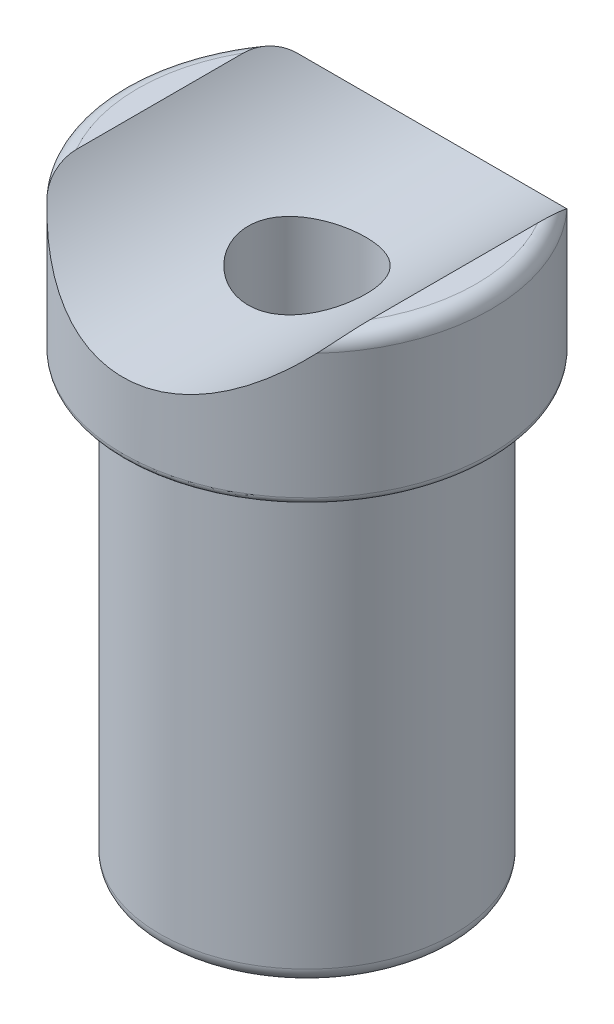
ISO-10303-21;
HEADER;
FILE_DESCRIPTION(('STEP AP214'),'2;1');
FILE_NAME('part.step','',(''),(''),'','','');
FILE_SCHEMA(('AUTOMOTIVE_DESIGN { 1 0 10303 214 1 1 1 1 }'));
ENDSEC;
DATA;
#1=APPLICATION_CONTEXT('core data for automotive mechanical design processes');
#2=APPLICATION_PROTOCOL_DEFINITION('international standard','automotive_design',2000,#1);
#3=PRODUCT_CONTEXT('',#1,'mechanical');
#4=PRODUCT('Part','Part','',(#3));
#5=PRODUCT_RELATED_PRODUCT_CATEGORY('part','',(#4));
#6=PRODUCT_DEFINITION_FORMATION('','',#4);
#7=PRODUCT_DEFINITION_CONTEXT('part definition',#1,'design');
#8=PRODUCT_DEFINITION('design','',#6,#7);
#9=PRODUCT_DEFINITION_SHAPE('','',#8);
#10=(LENGTH_UNIT() NAMED_UNIT(*) SI_UNIT(.MILLI.,.METRE.));
#11=(NAMED_UNIT(*) PLANE_ANGLE_UNIT() SI_UNIT($,.RADIAN.));
#12=(NAMED_UNIT(*) SI_UNIT($,.STERADIAN.) SOLID_ANGLE_UNIT());
#13=UNCERTAINTY_MEASURE_WITH_UNIT(LENGTH_MEASURE(1.E-05),#10,'distance_accuracy_value','');
#14=(GEOMETRIC_REPRESENTATION_CONTEXT(3) GLOBAL_UNCERTAINTY_ASSIGNED_CONTEXT((#13)) GLOBAL_UNIT_ASSIGNED_CONTEXT((#10,
#11,#12)) REPRESENTATION_CONTEXT('',''));
#15=CARTESIAN_POINT('',(0.,0.,0.));
#16=DIRECTION('',(0.,0.,1.));
#17=DIRECTION('',(1.,0.,0.));
#18=AXIS2_PLACEMENT_3D('',#15,#16,#17);
#19=CARTESIAN_POINT('',(-12.5,33.,0.));
#20=DIRECTION('',(0.,1.,0.));
#21=DIRECTION('',(0.,0.,1.));
#22=AXIS2_PLACEMENT_3D('',#19,#20,#21);
#23=PLANE('',#22);
#24=DIRECTION('',(0.,0.,1.));
#25=VECTOR('',#24,1.);
#26=CARTESIAN_POINT('',(-9.99999999999999,33.,-12.5));
#27=LINE('',#26,#25);
#28=CARTESIAN_POINT('',(-9.99999999999999,33.,-5.67890834580031));
#29=VERTEX_POINT('',#28);
#30=CARTESIAN_POINT('',(-9.99999999999999,33.,5.67890834580031));
#31=VERTEX_POINT('',#30);
#32=EDGE_CURVE('E89',#29,#31,#27,.T.);
#33=ORIENTED_EDGE('',*,*,#32,.F.);
#34=CARTESIAN_POINT('',(0.,33.,0.));
#35=DIRECTION('',(0.,1.,0.));
#36=DIRECTION('',(0.,0.,1.));
#37=AXIS2_PLACEMENT_3D('',#34,#35,#36);
#38=CIRCLE('',#37,11.5);
#39=EDGE_CURVE('E183',#29,#31,#38,.T.);
#40=ORIENTED_EDGE('',*,*,#39,.T.);
#41=EDGE_LOOP('',(#33,#40));
#42=FACE_BOUND('',#41,.T.);
#43=ADVANCED_FACE('F34',(#42),#23,.T.);
#44=DIRECTION('',(0.,0.,1.));
#45=VECTOR('',#44,1.);
#46=CARTESIAN_POINT('',(9.99999999999999,33.,-12.5));
#47=LINE('',#46,#45);
#48=CARTESIAN_POINT('',(9.99999999999999,33.,5.67890834580031));
#49=VERTEX_POINT('',#48);
#50=CARTESIAN_POINT('',(9.99999999999999,33.,-5.67890834580031));
#51=VERTEX_POINT('',#50);
#52=EDGE_CURVE('E78',#49,#51,#47,.F.);
#53=ORIENTED_EDGE('',*,*,#52,.F.);
#54=CARTESIAN_POINT('',(0.,33.,0.));
#55=DIRECTION('',(0.,1.,0.));
#56=DIRECTION('',(0.,0.,1.));
#57=AXIS2_PLACEMENT_3D('',#54,#55,#56);
#58=CIRCLE('',#57,11.5);
#59=EDGE_CURVE('E88',#49,#51,#58,.T.);
#60=ORIENTED_EDGE('',*,*,#59,.T.);
#61=EDGE_LOOP('',(#53,#60));
#62=FACE_BOUND('',#61,.T.);
#63=ADVANCED_FACE('F87',(#62),#23,.T.);
#64=CARTESIAN_POINT('',(0.,98.8342659185942,0.));
#65=DIRECTION('',(0.,1.,0.));
#66=DIRECTION('',(0.,0.,1.));
#67=AXIS2_PLACEMENT_3D('',#64,#65,#66);
#68=CYLINDRICAL_SURFACE('',#67,4.);
#69=CARTESIAN_POINT('',(0.,28.,4.));
#70=CARTESIAN_POINT('',(-0.218739515789949,28.0000005364093,3.99999939087354));
#71=CARTESIAN_POINT('',(-0.437486592647652,28.0057953960911,3.98199851180186));
#72=CARTESIAN_POINT('',(-0.868567253093707,28.0283434456943,3.91067045117685));
#73=CARTESIAN_POINT('',(-1.08089965843427,28.045098636161,3.85733682045523));
#74=CARTESIAN_POINT('',(-1.49287306447891,28.0877404091148,3.71733769697058));
#75=CARTESIAN_POINT('',(-1.69253368346149,28.1136124488703,3.63072526907349));
#76=CARTESIAN_POINT('',(-2.07449690712789,28.1718274589282,3.42685792478185));
#77=CARTESIAN_POINT('',(-2.25679651756237,28.2041715424903,3.30959773558599));
#78=CARTESIAN_POINT('',(-2.60473689448745,28.2730733016545,3.04378971623992));
#79=CARTESIAN_POINT('',(-2.76974023061599,28.3097260566775,2.89443225261642));
#80=CARTESIAN_POINT('',(-3.07283559233071,28.3825733574228,2.57039233363151));
#81=CARTESIAN_POINT('',(-3.21092229484498,28.4187678111901,2.39570488086294));
#82=CARTESIAN_POINT('',(-3.45978487684573,28.487629730026,2.02036786372393));
#83=CARTESIAN_POINT('',(-3.56975307774839,28.5201803591213,1.81915929682323));
#84=CARTESIAN_POINT('',(-3.75402292836496,28.5766335550272,1.39989414057514));
#85=CARTESIAN_POINT('',(-3.82833449433394,28.6005385257747,1.18184225503077));
#86=CARTESIAN_POINT('',(-3.93682835778228,28.6359969310092,0.74229348181632));
#87=CARTESIAN_POINT('',(-3.97219742115687,28.6479146267701,0.521119745614448));
#88=CARTESIAN_POINT('',(-4.00551082647404,28.6591292237863,0.075681002044328));
#89=CARTESIAN_POINT('',(-4.00346567735334,28.6584296689868,-0.148583119609549));
#90=CARTESIAN_POINT('',(-3.96293451839879,28.6448095228146,-0.583913962249063));
#91=CARTESIAN_POINT('',(-3.92597105327878,28.6323995653976,-0.795141133700956));
#92=CARTESIAN_POINT('',(-3.81912647431514,28.5975885650021,-1.20822211113994));
#93=CARTESIAN_POINT('',(-3.74924170672462,28.5751864130619,-1.41007487398266));
#94=CARTESIAN_POINT('',(-3.57749112898224,28.5225336455928,-1.80224464703698));
#95=CARTESIAN_POINT('',(-3.47515682759627,28.4921692631811,-1.99234054987134));
#96=CARTESIAN_POINT('',(-3.24173735834849,28.4270638785557,-2.35315510757427));
#97=CARTESIAN_POINT('',(-3.110644420678,28.3923216946597,-2.52386850686086));
#98=CARTESIAN_POINT('',(-2.81601378851059,28.3203406964289,-2.8496616821636));
#99=CARTESIAN_POINT('',(-2.65122340623531,28.283061979789,-3.00360194234647));
#100=CARTESIAN_POINT('',(-2.29770358054263,28.2116707971346,-3.28194669558469));
#101=CARTESIAN_POINT('',(-2.10897218913167,28.1775585891591,-3.40634878285739));
#102=CARTESIAN_POINT('',(-1.71065395178101,28.1159552563836,-3.62290860820041));
#103=CARTESIAN_POINT('',(-1.50090319860161,28.088522986301,-3.71478275209104));
#104=CARTESIAN_POINT('',(-1.06783962590281,28.0437959724956,-3.86159899165681));
#105=CARTESIAN_POINT('',(-0.844531157828868,28.0264979948842,-3.9165528695418));
#106=CARTESIAN_POINT('',(-0.400354473973302,28.0045143940215,-3.98600016666303));
#107=CARTESIAN_POINT('',(-0.179750715042687,27.9993484955461,-4.00203518402775));
#108=CARTESIAN_POINT('',(0.261025673970264,28.0007836170389,-3.99755195444675));
#109=CARTESIAN_POINT('',(0.481198365218598,28.0073828248949,-3.9770393367253));
#110=CARTESIAN_POINT('',(0.908837545509529,28.0312904920626,-3.90127471729709));
#111=CARTESIAN_POINT('',(1.11648590619506,28.0483128337684,-3.84695022478525));
#112=CARTESIAN_POINT('',(1.51965413650146,28.0910603501163,-3.70624550150937));
#113=CARTESIAN_POINT('',(1.71517248448531,28.1167866140113,-3.61986125849456));
#114=CARTESIAN_POINT('',(2.09399230967611,28.1751117245024,-3.41507245705462));
#115=CARTESIAN_POINT('',(2.27686405125242,28.2078668432478,-3.29591872014424));
#116=CARTESIAN_POINT('',(2.62052875751655,28.276514793988,-3.02986531753591));
#117=CARTESIAN_POINT('',(2.78131543888496,28.3124085141981,-2.88295778385424));
#118=CARTESIAN_POINT('',(3.08320803721588,28.3851758179191,-2.5583146009726));
#119=CARTESIAN_POINT('',(3.22321448689051,28.4220278958316,-2.3795493307788));
#120=CARTESIAN_POINT('',(3.47135354981424,28.4909889222464,-2.00026331385447));
#121=CARTESIAN_POINT('',(3.57948642564104,28.5230979098216,-1.79974274636488));
#122=CARTESIAN_POINT('',(3.76018950753079,28.5785934278356,-1.3828910533598));
#123=CARTESIAN_POINT('',(3.83287665768615,28.6020085794987,-1.16661466252577));
#124=CARTESIAN_POINT('',(3.94051670615503,28.6372179575168,-0.723981975474189));
#125=CARTESIAN_POINT('',(3.97548487516418,28.6490168865817,-0.49762979716004));
#126=CARTESIAN_POINT('',(4.00556338278915,28.6591518025308,-0.0528100770900255));
#127=CARTESIAN_POINT('',(4.00248471115016,28.6580995227155,0.165522528322479));
#128=CARTESIAN_POINT('',(3.96095887873426,28.6441460226564,0.598392513586752));
#129=CARTESIAN_POINT('',(3.92251352152803,28.6312454066342,0.812930086402577));
#130=CARTESIAN_POINT('',(3.81258331041153,28.5954864213896,1.2287085634422));
#131=CARTESIAN_POINT('',(3.74164069856766,28.5727918190809,1.43010799723217));
#132=CARTESIAN_POINT('',(3.56916068710955,28.520050610141,1.81830440100203));
#133=CARTESIAN_POINT('',(3.46761685286564,28.490002457502,2.00509828940675));
#134=CARTESIAN_POINT('',(3.23198166768581,28.4244126407906,2.36702407453602));
#135=CARTESIAN_POINT('',(3.09673271078947,28.388697023683,2.54137065683511));
#136=CARTESIAN_POINT('',(2.79953499482212,28.3165704788162,2.86547936455241));
#137=CARTESIAN_POINT('',(2.63757895417058,28.2801593638326,3.01523476299662));
#138=CARTESIAN_POINT('',(2.28478052574588,28.2092222949971,3.29114571480959));
#139=CARTESIAN_POINT('',(2.09312837940196,28.1748062029904,3.41629737971077));
#140=CARTESIAN_POINT('',(1.69040882481735,28.1131553075535,3.63245047024307));
#141=CARTESIAN_POINT('',(1.4793481580204,28.0859180232177,3.72346369830199));
#142=CARTESIAN_POINT('',(1.05915857911212,28.0432914733984,3.8631194495761));
#143=CARTESIAN_POINT('',(0.850941916218328,28.0272024674637,3.91429612645778));
#144=CARTESIAN_POINT('',(0.4284850026903,28.0055576614652,3.98273285726003));
#145=CARTESIAN_POINT('',(0.214246128153488,27.9999994746097,4.00000059661367));
#146=CARTESIAN_POINT('',(0.,28.,4.));
#147=B_SPLINE_CURVE_WITH_KNOTS('',3,(#69,#70,#71,#72,#73,#74,#75,#76,#77,#78,#79,#80,#81,#82,
#83,#84,#85,#86,#87,#88,#89,#90,#91,#92,#93,#94,#95,#96,#97,#98,#99,#100,#101,#102,#103,#104,
#105,#106,#107,#108,#109,#110,#111,#112,#113,#114,#115,#116,#117,#118,#119,#120,#121,#122,#123,
#124,#125,#126,#127,#128,#129,#130,#131,#132,#133,#134,#135,#136,#137,#138,#139,#140,#141,#142,
#143,#144,#145,#146),.UNSPECIFIED.,.T.,.F.,(4,2,2,2,2,2,2,2,2,2,2,2,2,2,2,2,2,2,2,2,2,2,2,2,2,2,
2,2,2,2,2,2,2,2,2,2,2,2,4),(0.,0.655430724666219,1.31098111587091,1.96549050527928,
2.62011257411758,3.29374295378918,3.96750641671065,4.65887072066567,5.35004264179887,
6.01951224998767,6.68879381985559,7.33017723381302,7.97163184802042,8.62280489842004,
9.27415409537619,9.95668212026654,10.6392657156648,11.3276617834058,12.0158380617097,
12.6762752648346,13.3366107533684,13.9795854097457,14.6226405610093,15.281833876428,
15.9412143491714,16.6280748263775,17.3149296449995,17.9995027669286,18.6837986322709,
19.3356533743721,19.9874748761257,20.6287955720839,21.2702512150686,21.937843916949,
22.6056189371906,23.2966571383325,23.9874562112942,24.6295685076847,25.2715352530413),.UNSPECIFIED.);
#148=CARTESIAN_POINT('',(0.,28.,4.));
#149=VERTEX_POINT('',#148);
#150=EDGE_CURVE('E122',#149,#149,#147,.T.);
#151=ORIENTED_EDGE('',*,*,#150,.F.);
#152=EDGE_LOOP('',(#151));
#153=FACE_BOUND('',#152,.T.);
#154=CARTESIAN_POINT('',(0.,16.,0.));
#155=DIRECTION('',(0.,1.,0.));
#156=DIRECTION('',(0.,0.,1.));
#157=AXIS2_PLACEMENT_3D('',#154,#155,#156);
#158=CIRCLE('',#157,4.);
#159=CARTESIAN_POINT('',(0.,16.,4.));
#160=VERTEX_POINT('',#159);
#161=EDGE_CURVE('E221',#160,#160,#158,.T.);
#162=ORIENTED_EDGE('',*,*,#161,.F.);
#163=EDGE_LOOP('',(#162));
#164=FACE_BOUND('',#163,.T.);
#165=ADVANCED_FACE('F146',(#153,#164),#68,.F.);
#166=CARTESIAN_POINT('',(-4.,16.,0.));
#167=DIRECTION('',(0.,-1.,0.));
#168=DIRECTION('',(0.,0.,-1.));
#169=AXIS2_PLACEMENT_3D('',#166,#167,#168);
#170=PLANE('',#169);
#171=ORIENTED_EDGE('',*,*,#161,.T.);
#172=EDGE_LOOP('',(#171));
#173=FACE_BOUND('',#172,.T.);
#174=CARTESIAN_POINT('',(0.,16.,0.));
#175=DIRECTION('',(0.,1.,0.));
#176=DIRECTION('',(0.,0.,1.));
#177=AXIS2_PLACEMENT_3D('',#174,#175,#176);
#178=CIRCLE('',#177,6.99999999999998);
#179=CARTESIAN_POINT('',(0.,16.,6.99999999999998));
#180=VERTEX_POINT('',#179);
#181=EDGE_CURVE('E219',#180,#180,#178,.T.);
#182=ORIENTED_EDGE('',*,*,#181,.F.);
#183=EDGE_LOOP('',(#182));
#184=FACE_BOUND('',#183,.T.);
#185=ADVANCED_FACE('F150',(#173,#184),#170,.T.);
#186=CARTESIAN_POINT('',(0.,98.8342659185942,0.));
#187=DIRECTION('',(0.,1.,0.));
#188=DIRECTION('',(0.,0.,1.));
#189=AXIS2_PLACEMENT_3D('',#186,#187,#188);
#190=CYLINDRICAL_SURFACE('',#189,6.99999999999998);
#191=CARTESIAN_POINT('',(0.,-6.00000000000001,0.));
#192=DIRECTION('',(0.,-1.,0.));
#193=DIRECTION('',(0.,0.,-1.));
#194=AXIS2_PLACEMENT_3D('',#191,#192,#193);
#195=CIRCLE('',#194,6.99999999999998);
#196=CARTESIAN_POINT('',(0.,-6.00000000000001,-6.99999999999998));
#197=VERTEX_POINT('',#196);
#198=EDGE_CURVE('E42',#197,#197,#195,.T.);
#199=ORIENTED_EDGE('',*,*,#198,.T.);
#200=EDGE_LOOP('',(#199));
#201=FACE_BOUND('',#200,.T.);
#202=ORIENTED_EDGE('',*,*,#181,.T.);
#203=EDGE_LOOP('',(#202));
#204=FACE_BOUND('',#203,.T.);
#205=ADVANCED_FACE('F154',(#201,#204),#190,.F.);
#206=CARTESIAN_POINT('',(-6.99999999999998,-7.,0.));
#207=DIRECTION('',(0.,-1.,0.));
#208=DIRECTION('',(0.,0.,-1.));
#209=AXIS2_PLACEMENT_3D('',#206,#207,#208);
#210=PLANE('',#209);
#211=CARTESIAN_POINT('',(0.,-7.,0.));
#212=DIRECTION('',(0.,-1.,0.));
#213=DIRECTION('',(0.,0.,-1.));
#214=AXIS2_PLACEMENT_3D('',#211,#212,#213);
#215=CIRCLE('',#214,7.99999999999998);
#216=CARTESIAN_POINT('',(0.,-7.,-7.99999999999998));
#217=VERTEX_POINT('',#216);
#218=EDGE_CURVE('E198',#217,#217,#215,.F.);
#219=ORIENTED_EDGE('',*,*,#218,.T.);
#220=EDGE_LOOP('',(#219));
#221=FACE_BOUND('',#220,.T.);
#222=CARTESIAN_POINT('',(0.,-7.,0.));
#223=DIRECTION('',(0.,-1.,0.));
#224=DIRECTION('',(0.,0.,-1.));
#225=AXIS2_PLACEMENT_3D('',#222,#223,#224);
#226=CIRCLE('',#225,8.99999999999998);
#227=CARTESIAN_POINT('',(0.,-7.,-8.99999999999998));
#228=VERTEX_POINT('',#227);
#229=EDGE_CURVE('E195',#228,#228,#226,.T.);
#230=ORIENTED_EDGE('',*,*,#229,.T.);
#231=EDGE_LOOP('',(#230));
#232=FACE_BOUND('',#231,.T.);
#233=ADVANCED_FACE('F158',(#221,#232),#210,.T.);
#234=CARTESIAN_POINT('',(0.,98.8342659185942,0.));
#235=DIRECTION('',(0.,1.,0.));
#236=DIRECTION('',(0.,0.,1.));
#237=AXIS2_PLACEMENT_3D('',#234,#235,#236);
#238=CYLINDRICAL_SURFACE('',#237,9.99999999999998);
#239=CARTESIAN_POINT('',(0.,-6.00000000000001,0.));
#240=DIRECTION('',(0.,-1.,0.));
#241=DIRECTION('',(0.,0.,-1.));
#242=AXIS2_PLACEMENT_3D('',#239,#240,#241);
#243=CIRCLE('',#242,9.99999999999998);
#244=CARTESIAN_POINT('',(0.,-6.00000000000001,-9.99999999999998));
#245=VERTEX_POINT('',#244);
#246=EDGE_CURVE('E11',#245,#245,#243,.F.);
#247=ORIENTED_EDGE('',*,*,#246,.T.);
#248=EDGE_LOOP('',(#247));
#249=FACE_BOUND('',#248,.T.);
#250=CARTESIAN_POINT('',(0.,23.,0.));
#251=DIRECTION('',(0.,1.,0.));
#252=DIRECTION('',(0.,0.,1.));
#253=AXIS2_PLACEMENT_3D('',#250,#251,#252);
#254=CIRCLE('',#253,9.99999999999998);
#255=CARTESIAN_POINT('',(0.,23.,9.99999999999998));
#256=VERTEX_POINT('',#255);
#257=EDGE_CURVE('E218',#256,#256,#254,.T.);
#258=ORIENTED_EDGE('',*,*,#257,.F.);
#259=EDGE_LOOP('',(#258));
#260=FACE_BOUND('',#259,.T.);
#261=ADVANCED_FACE('F162',(#249,#260),#238,.T.);
#262=CARTESIAN_POINT('',(-9.99999999999998,23.,0.));
#263=DIRECTION('',(0.,-1.,0.));
#264=DIRECTION('',(0.,0.,-1.));
#265=AXIS2_PLACEMENT_3D('',#262,#263,#264);
#266=PLANE('',#265);
#267=CARTESIAN_POINT('',(0.,23.,0.));
#268=DIRECTION('',(0.,-1.,0.));
#269=DIRECTION('',(0.,0.,-1.));
#270=AXIS2_PLACEMENT_3D('',#267,#268,#269);
#271=CIRCLE('',#270,12.);
#272=CARTESIAN_POINT('',(0.,23.,-12.));
#273=VERTEX_POINT('',#272);
#274=EDGE_CURVE('E190',#273,#273,#271,.T.);
#275=ORIENTED_EDGE('',*,*,#274,.T.);
#276=EDGE_LOOP('',(#275));
#277=FACE_BOUND('',#276,.T.);
#278=ORIENTED_EDGE('',*,*,#257,.T.);
#279=EDGE_LOOP('',(#278));
#280=FACE_BOUND('',#279,.T.);
#281=ADVANCED_FACE('F165',(#277,#280),#266,.T.);
#282=CARTESIAN_POINT('',(0.,98.8342659185942,0.));
#283=DIRECTION('',(0.,1.,0.));
#284=DIRECTION('',(0.,0.,1.));
#285=AXIS2_PLACEMENT_3D('',#282,#283,#284);
#286=CYLINDRICAL_SURFACE('',#285,12.5);
#287=CARTESIAN_POINT('',(0.,23.5,0.));
#288=DIRECTION('',(0.,-1.,0.));
#289=DIRECTION('',(0.,0.,-1.));
#290=AXIS2_PLACEMENT_3D('',#287,#288,#289);
#291=CIRCLE('',#290,12.5);
#292=CARTESIAN_POINT('',(0.,23.5,-12.5));
#293=VERTEX_POINT('',#292);
#294=EDGE_CURVE('E186',#293,#293,#291,.F.);
#295=ORIENTED_EDGE('',*,*,#294,.T.);
#296=EDGE_LOOP('',(#295));
#297=FACE_BOUND('',#296,.T.);
#298=CARTESIAN_POINT('',(0.,40.5,0.));
#299=DIRECTION('',(0.,0.707106781186547,-0.707106781186547));
#300=DIRECTION('',(0.,0.707106781186547,0.707106781186547));
#301=AXIS2_PLACEMENT_3D('',#298,#299,#300);
#302=ELLIPSE('',#301,17.6776695296637,12.5);
#303=CARTESIAN_POINT('',(9.16515138991168,32.,-8.5));
#304=VERTEX_POINT('',#303);
#305=CARTESIAN_POINT('',(-9.16515138991167,32.,-8.50000000000001));
#306=VERTEX_POINT('',#305);
#307=EDGE_CURVE('E93',#304,#306,#302,.T.);
#308=ORIENTED_EDGE('',*,*,#307,.F.);
#309=CARTESIAN_POINT('',(0.,32.,0.));
#310=DIRECTION('',(0.,1.,0.));
#311=DIRECTION('',(0.,0.,1.));
#312=AXIS2_PLACEMENT_3D('',#309,#310,#311);
#313=CIRCLE('',#312,12.5);
#314=CARTESIAN_POINT('',(9.16515138991167,32.,8.50000000000001));
#315=VERTEX_POINT('',#314);
#316=EDGE_CURVE('E187',#304,#315,#313,.F.);
#317=ORIENTED_EDGE('',*,*,#316,.T.);
#318=CARTESIAN_POINT('',(0.,40.5,0.));
#319=DIRECTION('',(0.,0.707106781186547,0.707106781186547));
#320=DIRECTION('',(0.,0.707106781186547,-0.707106781186547));
#321=AXIS2_PLACEMENT_3D('',#318,#319,#320);
#322=ELLIPSE('',#321,17.6776695296637,12.5);
#323=CARTESIAN_POINT('',(-9.16515138991168,32.,8.5));
#324=VERTEX_POINT('',#323);
#325=EDGE_CURVE('E79',#324,#315,#322,.T.);
#326=ORIENTED_EDGE('',*,*,#325,.F.);
#327=CARTESIAN_POINT('',(0.,32.,0.));
#328=DIRECTION('',(0.,1.,0.));
#329=DIRECTION('',(0.,0.,1.));
#330=AXIS2_PLACEMENT_3D('',#327,#328,#329);
#331=CIRCLE('',#330,12.5);
#332=EDGE_CURVE('E49',#324,#306,#331,.F.);
#333=ORIENTED_EDGE('',*,*,#332,.T.);
#334=EDGE_LOOP('',(#308,#317,#326,#333));
#335=FACE_BOUND('',#334,.T.);
#336=ADVANCED_FACE('F116',(#297,#335),#286,.T.);
#337=CARTESIAN_POINT('',(0.,40.5,-12.5));
#338=DIRECTION('',(0.,0.,1.));
#339=DIRECTION('',(1.,0.,0.));
#340=AXIS2_PLACEMENT_3D('',#337,#338,#339);
#341=CYLINDRICAL_SURFACE('',#340,12.5);
#342=ORIENTED_EDGE('',*,*,#150,.T.);
#343=EDGE_LOOP('',(#342));
#344=FACE_BOUND('',#343,.T.);
#345=ORIENTED_EDGE('',*,*,#52,.T.);
#346=CARTESIAN_POINT('',(9.99999999999999,33.,-5.67890834580031));
#347=CARTESIAN_POINT('',(9.99999358867709,32.9999923930312,-5.73215947243771));
#348=CARTESIAN_POINT('',(9.99922285958929,32.9989637073092,-5.78539769560187));
#349=CARTESIAN_POINT('',(9.99623870748193,32.9949869548921,-5.89175066509411));
#350=CARTESIAN_POINT('',(9.99402561795479,32.9920393318802,-5.94486543711745));
#351=CARTESIAN_POINT('',(9.98535413110856,32.9805054159806,-6.10385945574845));
#352=CARTESIAN_POINT('',(9.9768633282083,32.9692278102986,-6.20944443667825));
#353=CARTESIAN_POINT('',(9.95462146774807,32.9398506150286,-6.42048832323334));
#354=CARTESIAN_POINT('',(9.94080428309991,32.921665309553,-6.52592821101465));
#355=CARTESIAN_POINT('',(9.90797473269441,32.8787961587421,-6.73462688234872));
#356=CARTESIAN_POINT('',(9.88896157525124,32.8541113231251,-6.83788533094092));
#357=CARTESIAN_POINT('',(9.82354149559769,32.769976924966,-7.14540532694651));
#358=CARTESIAN_POINT('',(9.76894459681595,32.7007088899347,-7.3455455975755));
#359=CARTESIAN_POINT('',(9.66958377766715,32.5783955168596,-7.63061444072282));
#360=CARTESIAN_POINT('',(9.63368840293231,32.5347168161433,-7.72285524591281));
#361=CARTESIAN_POINT('',(9.55566488860958,32.4412786834085,-7.90141698098931));
#362=CARTESIAN_POINT('',(9.51354097161989,32.3915233749314,-7.98774186395903));
#363=CARTESIAN_POINT('',(9.42420332144098,32.2878808193866,-8.15008189394308));
#364=CARTESIAN_POINT('',(9.37721961169729,32.2341994038578,-8.22635228121484));
#365=CARTESIAN_POINT('',(9.3016923822232,32.149553603342,-8.33425655679527));
#366=CARTESIAN_POINT('',(9.27561536538519,32.1205867073073,-8.36920674555858));
#367=CARTESIAN_POINT('',(9.22170945766244,32.0612988208329,-8.43658556271437));
#368=CARTESIAN_POINT('',(9.19387895343194,32.0309765910576,-8.46901180571764));
#369=CARTESIAN_POINT('',(9.16515138991168,32.,-8.50000000000002));
#370=B_SPLINE_CURVE_WITH_KNOTS('',3,(#346,#347,#348,#349,#350,#351,#352,#353,#354,#355,#356,
#357,#358,#359,#360,#361,#362,#363,#364,#365,#366,#367,#368,#369),.UNSPECIFIED.,.F.,.F.,(4,2,2,
2,2,2,2,2,2,2,2,4),(0.,0.159716754082529,0.319396592678268,0.638588749704835,0.96187840090978,
1.28521733772206,1.93751752854946,2.26169586691153,2.58565542994695,2.89826520338321,
3.05522210806611,3.21232559610752),.UNSPECIFIED.);
#371=EDGE_CURVE('E56',#51,#304,#370,.T.);
#372=ORIENTED_EDGE('',*,*,#371,.T.);
#373=ORIENTED_EDGE('',*,*,#307,.T.);
#374=CARTESIAN_POINT('',(-9.16515138991168,32.,-8.50000000000001));
#375=CARTESIAN_POINT('',(-9.20461689428915,32.0425574844745,-8.45740482366518));
#376=CARTESIAN_POINT('',(-9.24239631828783,32.0838840881928,-8.41212341344463));
#377=CARTESIAN_POINT('',(-9.31466997110097,32.1639431954172,-8.31703760881375));
#378=CARTESIAN_POINT('',(-9.34916928754692,32.2026796876914,-8.26724046098936));
#379=CARTESIAN_POINT('',(-9.41490170913613,32.277343322499,-8.16413388454434));
#380=CARTESIAN_POINT('',(-9.44615263092406,32.3132854834825,-8.11084654968535));
#381=CARTESIAN_POINT('',(-9.50575984537123,32.3825735245085,-8.00103409806088));
#382=CARTESIAN_POINT('',(-9.53411443080396,32.4159178705699,-7.94450710199129));
#383=CARTESIAN_POINT('',(-9.63723796617841,32.538360287494,-7.72309454277757));
#384=CARTESIAN_POINT('',(-9.70240969839935,32.6183074436731,-7.54849306769246));
#385=CARTESIAN_POINT('',(-9.81323533975619,32.7567253937224,-7.18434180063721));
#386=CARTESIAN_POINT('',(-9.85878483270783,32.8150810659974,-6.99471824423527));
#387=CARTESIAN_POINT('',(-9.91211092220365,32.884174868627,-6.70958440954222));
#388=CARTESIAN_POINT('',(-9.92711497828031,32.9037618151673,-6.6174321065178));
#389=CARTESIAN_POINT('',(-9.95305167380038,32.9377760622921,-6.43161708571843));
#390=CARTESIAN_POINT('',(-9.96398518420681,32.952204466609,-6.33795469553237));
#391=CARTESIAN_POINT('',(-9.98163372054529,32.975559914271,-6.1503711492368));
#392=CARTESIAN_POINT('',(-9.98838443080221,32.9845334811202,-6.05645924534034));
#393=CARTESIAN_POINT('',(-9.99526880689302,32.9936949844625,-5.91514477844245));
#394=CARTESIAN_POINT('',(-9.99702335643758,32.9960323993907,-5.86795146526168));
#395=CARTESIAN_POINT('',(-9.99938698346769,32.9991825797586,-5.77347786822935));
#396=CARTESIAN_POINT('',(-9.99999586250574,32.99999508106,-5.72619757073025));
#397=CARTESIAN_POINT('',(-9.99999999999999,33.,-5.67890834580031));
#398=B_SPLINE_CURVE_WITH_KNOTS('',3,(#374,#375,#376,#377,#378,#379,#380,#381,#382,#383,#384,
#385,#386,#387,#388,#389,#390,#391,#392,#393,#394,#395,#396,#397),.UNSPECIFIED.,.F.,.F.,(4,2,2,
2,2,2,2,2,2,2,2,4),(0.,0.215807586096395,0.431274786820465,0.645489783253474,0.859830327388716,
1.46483461037735,2.07301969732222,2.35902177707365,2.6449626265594,2.92842920015198,
3.07024658928136,3.21208854107402),.UNSPECIFIED.);
#399=EDGE_CURVE('E92',#306,#29,#398,.T.);
#400=ORIENTED_EDGE('',*,*,#399,.T.);
#401=ORIENTED_EDGE('',*,*,#32,.T.);
#402=CARTESIAN_POINT('',(-9.99999999999999,33.,5.67890834580031));
#403=CARTESIAN_POINT('',(-9.99999358867709,32.9999923930312,5.73215947243771));
#404=CARTESIAN_POINT('',(-9.99922285958929,32.9989637073092,5.78539769560187));
#405=CARTESIAN_POINT('',(-9.99623870748193,32.9949869548921,5.89175066509411));
#406=CARTESIAN_POINT('',(-9.99402561795479,32.9920393318802,5.94486543711745));
#407=CARTESIAN_POINT('',(-9.98535413110856,32.9805054159806,6.10385945574845));
#408=CARTESIAN_POINT('',(-9.9768633282083,32.9692278102986,6.20944443667825));
#409=CARTESIAN_POINT('',(-9.95462146774807,32.9398506150286,6.42048832323334));
#410=CARTESIAN_POINT('',(-9.94080428309991,32.921665309553,6.52592821101465));
#411=CARTESIAN_POINT('',(-9.90797473269441,32.8787961587421,6.73462688234872));
#412=CARTESIAN_POINT('',(-9.88896157525124,32.8541113231251,6.83788533094092));
#413=CARTESIAN_POINT('',(-9.82354149559769,32.769976924966,7.14540532694651));
#414=CARTESIAN_POINT('',(-9.76894459681595,32.7007088899347,7.3455455975755));
#415=CARTESIAN_POINT('',(-9.66958377766715,32.5783955168596,7.63061444072282));
#416=CARTESIAN_POINT('',(-9.63368840293231,32.5347168161433,7.72285524591281));
#417=CARTESIAN_POINT('',(-9.55566488860958,32.4412786834085,7.90141698098931));
#418=CARTESIAN_POINT('',(-9.51354097161989,32.3915233749314,7.98774186395903));
#419=CARTESIAN_POINT('',(-9.42420332144098,32.2878808193866,8.15008189394308));
#420=CARTESIAN_POINT('',(-9.37721961169729,32.2341994038578,8.22635228121484));
#421=CARTESIAN_POINT('',(-9.3016923822232,32.149553603342,8.33425655679527));
#422=CARTESIAN_POINT('',(-9.27561536538519,32.1205867073073,8.36920674555858));
#423=CARTESIAN_POINT('',(-9.22170945766244,32.0612988208329,8.43658556271437));
#424=CARTESIAN_POINT('',(-9.19387895343194,32.0309765910576,8.46901180571764));
#425=CARTESIAN_POINT('',(-9.16515138991168,32.,8.50000000000002));
#426=B_SPLINE_CURVE_WITH_KNOTS('',3,(#402,#403,#404,#405,#406,#407,#408,#409,#410,#411,#412,
#413,#414,#415,#416,#417,#418,#419,#420,#421,#422,#423,#424,#425),.UNSPECIFIED.,.F.,.F.,(4,2,2,
2,2,2,2,2,2,2,2,4),(0.,0.159716754082529,0.319396592678268,0.638588749704835,0.96187840090978,
1.28521733772206,1.93751752854946,2.26169586691153,2.58565542994695,2.89826520338321,
3.05522210806611,3.21232559610752),.UNSPECIFIED.);
#427=EDGE_CURVE('E83',#31,#324,#426,.T.);
#428=ORIENTED_EDGE('',*,*,#427,.T.);
#429=ORIENTED_EDGE('',*,*,#325,.T.);
#430=CARTESIAN_POINT('',(9.16515138991168,32.,8.50000000000001));
#431=CARTESIAN_POINT('',(9.20461689428915,32.0425574844745,8.45740482366518));
#432=CARTESIAN_POINT('',(9.24239631828783,32.0838840881928,8.41212341344463));
#433=CARTESIAN_POINT('',(9.31466997110097,32.1639431954172,8.31703760881375));
#434=CARTESIAN_POINT('',(9.34916928754692,32.2026796876914,8.26724046098936));
#435=CARTESIAN_POINT('',(9.41490170913613,32.277343322499,8.16413388454434));
#436=CARTESIAN_POINT('',(9.44615263092406,32.3132854834825,8.11084654968535));
#437=CARTESIAN_POINT('',(9.50575984537123,32.3825735245085,8.00103409806088));
#438=CARTESIAN_POINT('',(9.53411443080396,32.4159178705699,7.94450710199129));
#439=CARTESIAN_POINT('',(9.63723796617841,32.538360287494,7.72309454277757));
#440=CARTESIAN_POINT('',(9.70240969839935,32.6183074436731,7.54849306769246));
#441=CARTESIAN_POINT('',(9.81323533975619,32.7567253937224,7.18434180063721));
#442=CARTESIAN_POINT('',(9.85878483270783,32.8150810659974,6.99471824423527));
#443=CARTESIAN_POINT('',(9.91211092220365,32.884174868627,6.70958440954222));
#444=CARTESIAN_POINT('',(9.92711497828031,32.9037618151673,6.6174321065178));
#445=CARTESIAN_POINT('',(9.95305167380038,32.9377760622921,6.43161708571843));
#446=CARTESIAN_POINT('',(9.96398518420681,32.952204466609,6.33795469553237));
#447=CARTESIAN_POINT('',(9.98163372054529,32.975559914271,6.1503711492368));
#448=CARTESIAN_POINT('',(9.98838443080221,32.9845334811202,6.05645924534034));
#449=CARTESIAN_POINT('',(9.99526880689302,32.9936949844625,5.91514477844245));
#450=CARTESIAN_POINT('',(9.99702335643758,32.9960323993907,5.86795146526168));
#451=CARTESIAN_POINT('',(9.99938698346769,32.9991825797586,5.77347786822935));
#452=CARTESIAN_POINT('',(9.99999586250574,32.99999508106,5.72619757073025));
#453=CARTESIAN_POINT('',(9.99999999999999,33.,5.67890834580031));
#454=B_SPLINE_CURVE_WITH_KNOTS('',3,(#430,#431,#432,#433,#434,#435,#436,#437,#438,#439,#440,
#441,#442,#443,#444,#445,#446,#447,#448,#449,#450,#451,#452,#453),.UNSPECIFIED.,.F.,.F.,(4,2,2,
2,2,2,2,2,2,2,2,4),(0.,0.215807586096395,0.431274786820465,0.645489783253474,0.859830327388716,
1.46483461037735,2.07301969732222,2.35902177707365,2.6449626265594,2.92842920015198,
3.07024658928136,3.21208854107402),.UNSPECIFIED.);
#455=EDGE_CURVE('E75',#315,#49,#454,.T.);
#456=ORIENTED_EDGE('',*,*,#455,.T.);
#457=EDGE_LOOP('',(#345,#372,#373,#400,#401,#428,#429,#456));
#458=FACE_BOUND('',#457,.T.);
#459=ADVANCED_FACE('F77',(#344,#458),#341,.F.);
#460=CARTESIAN_POINT('',(0.,32.,0.));
#461=DIRECTION('',(0.,1.,0.));
#462=DIRECTION('',(0.,0.,1.));
#463=AXIS2_PLACEMENT_3D('',#460,#461,#462);
#464=TOROIDAL_SURFACE('',#463,11.5,1.);
#465=ORIENTED_EDGE('',*,*,#455,.F.);
#466=ORIENTED_EDGE('',*,*,#316,.F.);
#467=ORIENTED_EDGE('',*,*,#371,.F.);
#468=ORIENTED_EDGE('',*,*,#59,.F.);
#469=EDGE_LOOP('',(#465,#466,#467,#468));
#470=FACE_BOUND('',#469,.T.);
#471=ADVANCED_FACE('F91',(#470),#464,.T.);
#472=CARTESIAN_POINT('',(0.,32.,0.));
#473=DIRECTION('',(0.,1.,0.));
#474=DIRECTION('',(0.,0.,1.));
#475=AXIS2_PLACEMENT_3D('',#472,#473,#474);
#476=TOROIDAL_SURFACE('',#475,11.5,1.);
#477=ORIENTED_EDGE('',*,*,#399,.F.);
#478=ORIENTED_EDGE('',*,*,#332,.F.);
#479=ORIENTED_EDGE('',*,*,#427,.F.);
#480=ORIENTED_EDGE('',*,*,#39,.F.);
#481=EDGE_LOOP('',(#477,#478,#479,#480));
#482=FACE_BOUND('',#481,.T.);
#483=ADVANCED_FACE('F109',(#482),#476,.T.);
#484=CARTESIAN_POINT('',(0.,23.5,0.));
#485=DIRECTION('',(0.,-1.,0.));
#486=DIRECTION('',(0.,0.,-1.));
#487=AXIS2_PLACEMENT_3D('',#484,#485,#486);
#488=TOROIDAL_SURFACE('',#487,12.,0.5);
#489=ORIENTED_EDGE('',*,*,#274,.F.);
#490=EDGE_LOOP('',(#489));
#491=FACE_BOUND('',#490,.T.);
#492=ORIENTED_EDGE('',*,*,#294,.F.);
#493=EDGE_LOOP('',(#492));
#494=FACE_BOUND('',#493,.T.);
#495=ADVANCED_FACE('F207',(#491,#494),#488,.T.);
#496=CARTESIAN_POINT('',(0.,-6.00000000000001,0.));
#497=DIRECTION('',(0.,-1.,0.));
#498=DIRECTION('',(0.,0.,-1.));
#499=AXIS2_PLACEMENT_3D('',#496,#497,#498);
#500=TOROIDAL_SURFACE('',#499,7.99999999999998,1.);
#501=ORIENTED_EDGE('',*,*,#198,.F.);
#502=EDGE_LOOP('',(#501));
#503=FACE_BOUND('',#502,.T.);
#504=ORIENTED_EDGE('',*,*,#218,.F.);
#505=EDGE_LOOP('',(#504));
#506=FACE_BOUND('',#505,.T.);
#507=ADVANCED_FACE('F204',(#503,#506),#500,.T.);
#508=CARTESIAN_POINT('',(0.,-6.00000000000001,0.));
#509=DIRECTION('',(0.,-1.,0.));
#510=DIRECTION('',(0.,0.,-1.));
#511=AXIS2_PLACEMENT_3D('',#508,#509,#510);
#512=TOROIDAL_SURFACE('',#511,8.99999999999998,1.);
#513=ORIENTED_EDGE('',*,*,#229,.F.);
#514=EDGE_LOOP('',(#513));
#515=FACE_BOUND('',#514,.T.);
#516=ORIENTED_EDGE('',*,*,#246,.F.);
#517=EDGE_LOOP('',(#516));
#518=FACE_BOUND('',#517,.T.);
#519=ADVANCED_FACE('F36',(#515,#518),#512,.T.);
#520=CLOSED_SHELL('',(#43,#63,#165,#185,#205,#233,#261,#281,#336,#459,#471,#483,#495,#507,#519));
#521=MANIFOLD_SOLID_BREP('B2',#520);
#522=ADVANCED_BREP_SHAPE_REPRESENTATION('',(#18,#521),#14);
#523=SHAPE_DEFINITION_REPRESENTATION(#9,#522);
ENDSEC;
END-ISO-10303-21;
